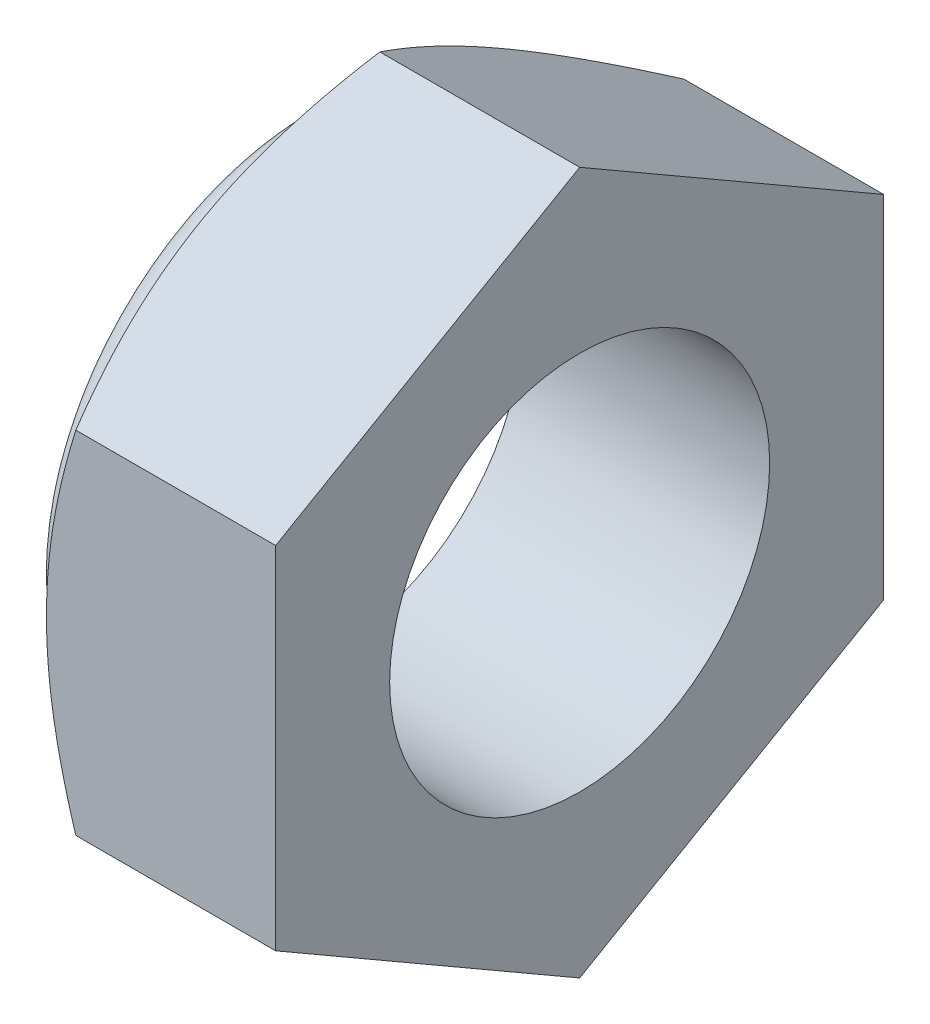
ISO-10303-21;
HEADER;
FILE_DESCRIPTION(('STEP AP214'),'2;1');
FILE_NAME('part.step','',(''),(''),'','','');
FILE_SCHEMA(('AUTOMOTIVE_DESIGN { 1 0 10303 214 1 1 1 1 }'));
ENDSEC;
DATA;
#1=APPLICATION_CONTEXT('core data for automotive mechanical design processes');
#2=APPLICATION_PROTOCOL_DEFINITION('international standard','automotive_design',2000,#1);
#3=PRODUCT_CONTEXT('',#1,'mechanical');
#4=PRODUCT('Part','Part','',(#3));
#5=PRODUCT_RELATED_PRODUCT_CATEGORY('part','',(#4));
#6=PRODUCT_DEFINITION_FORMATION('','',#4);
#7=PRODUCT_DEFINITION_CONTEXT('part definition',#1,'design');
#8=PRODUCT_DEFINITION('design','',#6,#7);
#9=PRODUCT_DEFINITION_SHAPE('','',#8);
#10=(LENGTH_UNIT() NAMED_UNIT(*) SI_UNIT(.MILLI.,.METRE.));
#11=(NAMED_UNIT(*) PLANE_ANGLE_UNIT() SI_UNIT($,.RADIAN.));
#12=(NAMED_UNIT(*) SI_UNIT($,.STERADIAN.) SOLID_ANGLE_UNIT());
#13=UNCERTAINTY_MEASURE_WITH_UNIT(LENGTH_MEASURE(1.E-05),#10,'distance_accuracy_value','');
#14=(GEOMETRIC_REPRESENTATION_CONTEXT(3) GLOBAL_UNCERTAINTY_ASSIGNED_CONTEXT((#13)) GLOBAL_UNIT_ASSIGNED_CONTEXT((#10,
#11,#12)) REPRESENTATION_CONTEXT('',''));
#15=CARTESIAN_POINT('',(0.,0.,0.));
#16=DIRECTION('',(0.,0.,1.));
#17=DIRECTION('',(1.,0.,0.));
#18=AXIS2_PLACEMENT_3D('',#15,#16,#17);
#19=CARTESIAN_POINT('',(0.,9.23760430703401,16.));
#20=DIRECTION('',(1.,0.,0.));
#21=DIRECTION('',(0.,0.,-1.));
#22=AXIS2_PLACEMENT_3D('',#19,#20,#21);
#23=PLANE('',#22);
#24=CARTESIAN_POINT('',(0.,0.,0.));
#25=DIRECTION('',(1.,0.,0.));
#26=DIRECTION('',(0.,0.,-1.));
#27=AXIS2_PLACEMENT_3D('',#24,#25,#26);
#28=CIRCLE('',#27,10.);
#29=CARTESIAN_POINT('',(0.,0.,10.));
#30=VERTEX_POINT('',#29);
#31=EDGE_CURVE('E211',#30,#30,#28,.T.);
#32=ORIENTED_EDGE('',*,*,#31,.T.);
#33=EDGE_LOOP('',(#32));
#34=FACE_BOUND('',#33,.T.);
#35=CARTESIAN_POINT('',(0.,0.,0.));
#36=DIRECTION('',(-1.,0.,0.));
#37=DIRECTION('',(0.,0.,1.));
#38=AXIS2_PLACEMENT_3D('',#35,#36,#37);
#39=CIRCLE('',#38,11.75);
#40=CARTESIAN_POINT('',(0.,0.,11.75));
#41=VERTEX_POINT('',#40);
#42=EDGE_CURVE('E11',#41,#41,#39,.F.);
#43=ORIENTED_EDGE('',*,*,#42,.F.);
#44=EDGE_LOOP('',(#43));
#45=FACE_BOUND('',#44,.T.);
#46=ADVANCED_FACE('F36',(#34,#45),#23,.F.);
#47=CARTESIAN_POINT('',(13.,18.475208614068,0.));
#48=DIRECTION('',(0.,-0.866025403784439,-0.5));
#49=DIRECTION('',(0.,0.5,-0.866025403784439));
#50=AXIS2_PLACEMENT_3D('',#47,#48,#49);
#51=PLANE('',#50);
#52=CARTESIAN_POINT('',(2.48402782965537,9.23748883698017,16.0002));
#53=CARTESIAN_POINT('',(2.35622189514865,9.44204117994002,15.6459049491863));
#54=CARTESIAN_POINT('',(2.23417552529317,9.64752331072618,15.2899994586171));
#55=CARTESIAN_POINT('',(2.00328958075527,10.0604195708602,14.5748421578098));
#56=CARTESIAN_POINT('',(1.89445538793848,10.2678344507007,14.2155890476803));
#57=CARTESIAN_POINT('',(1.69150207832333,10.6850904743633,13.4928804149324));
#58=CARTESIAN_POINT('',(1.59742535654908,10.8949368135091,13.1294158937497));
#59=CARTESIAN_POINT('',(1.42618391855995,11.3163430988134,12.3995187969738));
#60=CARTESIAN_POINT('',(1.34901800028337,11.527902922064,12.0330864342635));
#61=CARTESIAN_POINT('',(1.21528062863202,11.9463731920176,11.3082746652467));
#62=CARTESIAN_POINT('',(1.15817756809927,12.1532408961974,10.9499692911623));
#63=CARTESIAN_POINT('',(1.06290011847831,12.5680769915954,10.2314520971194));
#64=CARTESIAN_POINT('',(1.02472616226442,12.776045407875,9.87124023375338));
#65=CARTESIAN_POINT('',(0.96834746611396,13.1923576425367,9.15016629150687));
#66=CARTESIAN_POINT('',(0.95011366037074,13.4007004699159,8.78930592909349));
#67=CARTESIAN_POINT('',(0.93402035627322,13.8175788171063,8.06725145118442));
#68=CARTESIAN_POINT('',(0.936160048662314,14.0261143289348,7.70605734951504));
#69=CARTESIAN_POINT('',(0.958937588993571,14.412255701082,7.03724087405184));
#70=CARTESIAN_POINT('',(0.976811260230783,14.5899040223273,6.72954495577557));
#71=CARTESIAN_POINT('',(1.02697198795611,14.9446912735804,6.11503541072753));
#72=CARTESIAN_POINT('',(1.05925914160921,15.1218302001461,5.80822178991758));
#73=CARTESIAN_POINT('',(1.13767882018117,15.4755261882536,5.19560236808195));
#74=CARTESIAN_POINT('',(1.18382601047696,15.6520824322084,4.88979798315878));
#75=CARTESIAN_POINT('',(1.28913493966902,16.0042145183511,4.27988731898442));
#76=CARTESIAN_POINT('',(1.34829663434647,16.179790363868,3.97578103396726));
#77=CARTESIAN_POINT('',(1.54722369115664,16.7137423414229,3.05094908004027));
#78=CARTESIAN_POINT('',(1.70635721297245,17.0703163791325,2.43334473006729));
#79=CARTESIAN_POINT('',(2.06622138845492,17.7773355868302,1.20875154040773));
#80=CARTESIAN_POINT('',(2.26685434978692,18.1277930914713,0.601741336475672));
#81=CARTESIAN_POINT('',(2.48402782965537,18.4753240841219,-0.000199999999998277));
#82=B_SPLINE_CURVE_WITH_KNOTS('',3,(#52,#53,#54,#55,#56,#57,#58,#59,#60,#61,#62,#63,#64,#65,#66,
#67,#68,#69,#70,#71,#72,#73,#74,#75,#76,#77,#78,#79,#80,#81),.UNSPECIFIED.,.F.,.F.,(4,2,2,2,2,2,
2,2,2,2,2,2,2,2,4),(0.,1.28585383832253,2.57222971292877,3.86223593816667,5.15215043681124,
6.40471628367197,7.65731077312322,8.90807697151976,10.1587934883851,11.2257389499925,
12.2926916042611,13.3607772079389,14.428859182683,16.6194032169616,18.8048480903253),.UNSPECIFIED.);
#83=CARTESIAN_POINT('',(2.48395567616295,9.23760430703401,16.));
#84=VERTEX_POINT('',#83);
#85=CARTESIAN_POINT('',(2.48395567616295,18.475208614068,0.));
#86=VERTEX_POINT('',#85);
#87=EDGE_CURVE('E52',#84,#86,#82,.T.);
#88=ORIENTED_EDGE('',*,*,#87,.F.);
#89=DIRECTION('',(-1.,0.,0.));
#90=VECTOR('',#89,1.);
#91=CARTESIAN_POINT('',(13.,9.23760430703401,16.));
#92=LINE('',#91,#90);
#93=CARTESIAN_POINT('',(13.,9.23760430703401,16.));
#94=VERTEX_POINT('',#93);
#95=EDGE_CURVE('E95',#94,#84,#92,.T.);
#96=ORIENTED_EDGE('',*,*,#95,.F.);
#97=DIRECTION('',(0.,-0.5,0.866025403784439));
#98=VECTOR('',#97,1.);
#99=CARTESIAN_POINT('',(13.,18.475208614068,0.));
#100=LINE('',#99,#98);
#101=CARTESIAN_POINT('',(13.,18.475208614068,0.));
#102=VERTEX_POINT('',#101);
#103=EDGE_CURVE('E206',#102,#94,#100,.T.);
#104=ORIENTED_EDGE('',*,*,#103,.F.);
#105=DIRECTION('',(-1.,0.,0.));
#106=VECTOR('',#105,1.);
#107=CARTESIAN_POINT('',(13.,18.475208614068,0.));
#108=LINE('',#107,#106);
#109=EDGE_CURVE('E108',#102,#86,#108,.T.);
#110=ORIENTED_EDGE('',*,*,#109,.T.);
#111=EDGE_LOOP('',(#88,#96,#104,#110));
#112=FACE_BOUND('',#111,.T.);
#113=ADVANCED_FACE('F38',(#112),#51,.F.);
#114=CARTESIAN_POINT('',(13.,9.23760430703401,16.));
#115=DIRECTION('',(0.,0.,-1.));
#116=DIRECTION('',(-1.,0.,0.));
#117=AXIS2_PLACEMENT_3D('',#114,#115,#116);
#118=PLANE('',#117);
#119=CARTESIAN_POINT('',(8.90480884351565,-23.8874698405771,16.));
#120=CARTESIAN_POINT('',(8.73111807847969,-23.5529035977373,16.));
#121=CARTESIAN_POINT('',(8.55831159888479,-23.2178785094247,16.));
#122=CARTESIAN_POINT('',(8.21466498912881,-22.5468166451278,16.));
#123=CARTESIAN_POINT('',(8.04382488207962,-22.2107798573107,16.));
#124=CARTESIAN_POINT('',(7.53449932339774,-21.2009086145887,16.));
#125=CARTESIAN_POINT('',(7.19926766658299,-20.5254266671798,16.));
#126=CARTESIAN_POINT('',(6.53748870411256,-19.1650638835834,16.));
#127=CARTESIAN_POINT('',(6.2110075493406,-18.4801507873137,16.));
#128=CARTESIAN_POINT('',(5.57162944400834,-17.1040336673482,16.));
#129=CARTESIAN_POINT('',(5.25873177584443,-16.4128299783182,16.));
#130=CARTESIAN_POINT('',(4.63977485054366,-14.9993640799181,16.));
#131=CARTESIAN_POINT('',(4.33430517875104,-14.2768423005994,16.));
#132=CARTESIAN_POINT('',(3.74686522382272,-12.8221279092357,16.));
#133=CARTESIAN_POINT('',(3.46489784400095,-12.0899341152801,16.));
#134=CARTESIAN_POINT('',(2.93200406970659,-10.6161520590153,16.));
#135=CARTESIAN_POINT('',(2.68100770247132,-9.87458930737348,16.));
#136=CARTESIAN_POINT('',(2.21809749012398,-8.37939453731843,16.));
#137=CARTESIAN_POINT('',(2.00617006051235,-7.62576681340267,16.));
#138=CARTESIAN_POINT('',(1.72259788114702,-6.47495720037005,16.));
#139=CARTESIAN_POINT('',(1.63277665566015,-6.0822284929594,16.));
#140=CARTESIAN_POINT('',(1.46773447890387,-5.2936985175366,16.));
#141=CARTESIAN_POINT('',(1.39251316176112,-4.89789732677937,16.));
#142=CARTESIAN_POINT('',(1.25811686640524,-4.10360329151073,16.));
#143=CARTESIAN_POINT('',(1.1989403797924,-3.70511070363431,16.));
#144=CARTESIAN_POINT('',(1.09790554126732,-2.90592044910313,16.));
#145=CARTESIAN_POINT('',(1.05604714401592,-2.50522278822409,16.));
#146=CARTESIAN_POINT('',(0.991113527542771,-1.70808399783427,16.));
#147=CARTESIAN_POINT('',(0.967777516838604,-1.31166424724103,16.));
#148=CARTESIAN_POINT('',(0.939471927912536,-0.518170941065775,16.));
#149=CARTESIAN_POINT('',(0.934502055283372,-0.121097396066097,16.));
#150=CARTESIAN_POINT('',(0.943055477654574,0.672878326331558,16.));
#151=CARTESIAN_POINT('',(0.956580059104823,1.06978048988742,16.));
#152=CARTESIAN_POINT('',(1.00178139793263,1.86255096679384,16.));
#153=CARTESIAN_POINT('',(1.0334588966755,2.25841923725684,16.));
#154=CARTESIAN_POINT('',(1.12631626658434,3.16668606371892,16.));
#155=CARTESIAN_POINT('',(1.19349053851954,3.67847687623873,16.));
#156=CARTESIAN_POINT('',(1.35476926930414,4.69779258400616,16.));
#157=CARTESIAN_POINT('',(1.44887673660199,5.20531699617247,16.));
#158=CARTESIAN_POINT('',(1.66107348424446,6.21562836759083,16.));
#159=CARTESIAN_POINT('',(1.77917830760468,6.71841203429148,16.));
#160=CARTESIAN_POINT('',(2.0361882039576,7.71858348374597,16.));
#161=CARTESIAN_POINT('',(2.17509301494932,8.215971334382,16.));
#162=CARTESIAN_POINT('',(2.47409845911886,9.21673920823729,16.));
#163=CARTESIAN_POINT('',(2.63461212177091,9.71999506380116,16.));
#164=CARTESIAN_POINT('',(2.97139133833493,10.7211812260306,16.));
#165=CARTESIAN_POINT('',(3.14765699510677,11.2191114978966,16.));
#166=CARTESIAN_POINT('',(3.51339392660486,12.2099042127266,16.));
#167=CARTESIAN_POINT('',(3.70286114789863,12.702768158394,16.));
#168=CARTESIAN_POINT('',(4.09295035287518,13.6840363511946,16.));
#169=CARTESIAN_POINT('',(4.29357219347068,14.1724406554408,16.));
#170=CARTESIAN_POINT('',(4.79341837196844,15.3566186117951,16.));
#171=CARTESIAN_POINT('',(5.09761158238887,16.0502926736324,16.));
#172=CARTESIAN_POINT('',(5.72121783101163,17.4307869341618,16.));
#173=CARTESIAN_POINT('',(6.04063200741869,18.1176066156328,16.));
#174=CARTESIAN_POINT('',(6.69165198813326,19.4856571218058,16.));
#175=CARTESIAN_POINT('',(7.02326109097198,20.1668863725281,16.));
#176=CARTESIAN_POINT('',(7.69620543250852,21.5244893139814,16.));
#177=CARTESIAN_POINT('',(8.03754042078527,22.2008631291692,16.));
#178=CARTESIAN_POINT('',(8.72858600682176,23.5504545709518,16.));
#179=CARTESIAN_POINT('',(9.07830720891962,24.2236667578039,16.));
#180=CARTESIAN_POINT('',(9.7842672937288,25.5666644018743,16.));
#181=CARTESIAN_POINT('',(10.1405062104184,26.2364498412048,16.));
#182=CARTESIAN_POINT('',(10.8583328215057,27.5730137838194,16.));
#183=CARTESIAN_POINT('',(11.2199196933931,28.2397927293331,16.));
#184=CARTESIAN_POINT('',(11.9476194301153,29.5708716243697,16.));
#185=CARTESIAN_POINT('',(12.3137322847267,30.2351715794878,16.));
#186=CARTESIAN_POINT('',(13.3515815778486,32.1055974053188,16.));
#187=CARTESIAN_POINT('',(14.0277202507287,33.3092805534282,16.));
#188=CARTESIAN_POINT('',(15.3894537366813,35.7113398581849,16.));
#189=CARTESIAN_POINT('',(16.0750489487848,36.9097157880512,16.));
#190=CARTESIAN_POINT('',(17.451421981919,39.2986883824702,16.));
#191=CARTESIAN_POINT('',(18.1421780249996,40.489297603171,16.));
#192=CARTESIAN_POINT('',(19.1825323827763,42.2726940621074,16.));
#193=CARTESIAN_POINT('',(19.5300092451093,42.8667208160212,16.));
#194=CARTESIAN_POINT('',(20.2262311006083,44.0540292798519,16.));
#195=CARTESIAN_POINT('',(20.5749760913922,44.6473109911656,16.));
#196=CARTESIAN_POINT('',(20.9242828358097,45.2402618749302,16.));
#197=B_SPLINE_CURVE_WITH_KNOTS('',3,(#119,#120,#121,#122,#123,#124,#125,#126,#127,#128,#129,
#130,#131,#132,#133,#134,#135,#136,#137,#138,#139,#140,#141,#142,#143,#144,#145,#146,#147,#148,
#149,#150,#151,#152,#153,#154,#155,#156,#157,#158,#159,#160,#161,#162,#163,#164,#165,#166,#167,
#168,#169,#170,#171,#172,#173,#174,#175,#176,#177,#178,#179,#180,#181,#182,#183,#184,#185,#186,
#187,#188,#189,#190,#191,#192,#193,#194,#195,#196),.UNSPECIFIED.,.F.,.F.,(4,2,2,2,2,2,2,2,2,2,2,
2,2,2,2,2,2,2,2,2,2,2,2,2,2,2,2,2,2,2,2,2,2,2,2,2,2,2,4),(0.,1.13089431456393,2.26180190762565,
4.52400056817067,6.80012284566329,9.07612473093047,11.4291351559062,13.7824358263693,
16.1303183586455,18.4773829721998,19.6857621290957,20.8941110001306,22.1023462329723,
23.3105783026067,24.5014810062565,25.6923646197781,26.8833310738103,28.0743461703911,
29.6220612136447,31.1699492047925,32.718842972648,34.2677172319554,35.8521117042882,
37.4365165234077,39.020436989663,40.6043371426648,42.8764098116049,45.1486526507255,
47.4215146818988,49.694318244447,51.9701655124478,54.246024648313,56.52153732579,
58.7970448642237,62.9387373202539,67.0806050782887,71.2100206170363,73.2745948522922,
75.3391652111168),.UNSPECIFIED.);
#198=CARTESIAN_POINT('',(2.48395567616295,-9.23760430703401,16.));
#199=VERTEX_POINT('',#198);
#200=EDGE_CURVE('E163',#199,#84,#197,.T.);
#201=ORIENTED_EDGE('',*,*,#200,.F.);
#202=DIRECTION('',(-1.,0.,0.));
#203=VECTOR('',#202,1.);
#204=CARTESIAN_POINT('',(13.,-9.23760430703401,16.));
#205=LINE('',#204,#203);
#206=CARTESIAN_POINT('',(13.,-9.23760430703401,16.));
#207=VERTEX_POINT('',#206);
#208=EDGE_CURVE('E117',#207,#199,#205,.T.);
#209=ORIENTED_EDGE('',*,*,#208,.F.);
#210=DIRECTION('',(0.,-1.,0.));
#211=VECTOR('',#210,1.);
#212=CARTESIAN_POINT('',(13.,9.23760430703401,16.));
#213=LINE('',#212,#211);
#214=EDGE_CURVE('E212',#94,#207,#213,.T.);
#215=ORIENTED_EDGE('',*,*,#214,.F.);
#216=ORIENTED_EDGE('',*,*,#95,.T.);
#217=EDGE_LOOP('',(#201,#209,#215,#216));
#218=FACE_BOUND('',#217,.T.);
#219=ADVANCED_FACE('F173',(#218),#118,.F.);
#220=CARTESIAN_POINT('',(13.,-9.23760430703401,16.));
#221=DIRECTION('',(0.,0.866025403784439,-0.5));
#222=DIRECTION('',(0.,0.5,0.866025403784439));
#223=AXIS2_PLACEMENT_3D('',#220,#221,#222);
#224=PLANE('',#223);
#225=CARTESIAN_POINT('',(2.48402782965537,-18.4753240841219,-0.0002));
#226=CARTESIAN_POINT('',(2.35622189514865,-18.270771741162,0.3540950508137));
#227=CARTESIAN_POINT('',(2.23417552529317,-18.0652896103758,0.710000541382855));
#228=CARTESIAN_POINT('',(2.00328958075526,-17.6523933502418,1.42515784219021));
#229=CARTESIAN_POINT('',(1.89445538793848,-17.4449784704013,1.78441095231972));
#230=CARTESIAN_POINT('',(1.69150207832333,-17.0277224467387,2.50711958506755));
#231=CARTESIAN_POINT('',(1.59742535654908,-16.817876107593,2.87058410625027));
#232=CARTESIAN_POINT('',(1.42618391855994,-16.3964698222887,3.60048120302616));
#233=CARTESIAN_POINT('',(1.34901800028337,-16.184909999038,3.96691356573654));
#234=CARTESIAN_POINT('',(1.21528062863202,-15.7664397290844,4.6917253347533));
#235=CARTESIAN_POINT('',(1.15817756809927,-15.5595720249047,5.05003070883773));
#236=CARTESIAN_POINT('',(1.06290011847831,-15.1447359295067,5.7685479028806));
#237=CARTESIAN_POINT('',(1.02472616226442,-14.936767513227,6.12875976624661));
#238=CARTESIAN_POINT('',(0.968347466113959,-14.5204552785653,6.84983370849313));
#239=CARTESIAN_POINT('',(0.950113660370739,-14.3121124511861,7.21069407090651));
#240=CARTESIAN_POINT('',(0.934020356273218,-13.8952341039957,7.93274854881558));
#241=CARTESIAN_POINT('',(0.936160048662314,-13.6866985921672,8.29394265048496));
#242=CARTESIAN_POINT('',(0.958937588993571,-13.3005572200201,8.96275912594816));
#243=CARTESIAN_POINT('',(0.976811260230782,-13.1229088987747,9.27045504422442));
#244=CARTESIAN_POINT('',(1.02697198795611,-12.7681216475216,9.88496458927246));
#245=CARTESIAN_POINT('',(1.05925914160921,-12.590982720956,10.1917782100824));
#246=CARTESIAN_POINT('',(1.13767882018117,-12.2372867328484,10.804397631918));
#247=CARTESIAN_POINT('',(1.18382601047695,-12.0607304888936,11.1102020168412));
#248=CARTESIAN_POINT('',(1.28913493966902,-11.7085984027509,11.7201126810156));
#249=CARTESIAN_POINT('',(1.34829663434647,-11.533022557234,12.0242189660327));
#250=CARTESIAN_POINT('',(1.54722369115664,-10.9990705796791,12.9490509199597));
#251=CARTESIAN_POINT('',(1.70635721297245,-10.6424965419695,13.5666552699327));
#252=CARTESIAN_POINT('',(2.06622138845492,-9.93547733427179,14.7912484595923));
#253=CARTESIAN_POINT('',(2.26685434978692,-9.58501982963076,15.3982586635243));
#254=CARTESIAN_POINT('',(2.48402782965537,-9.23748883698017,16.0002));
#255=B_SPLINE_CURVE_WITH_KNOTS('',3,(#225,#226,#227,#228,#229,#230,#231,#232,#233,#234,#235,
#236,#237,#238,#239,#240,#241,#242,#243,#244,#245,#246,#247,#248,#249,#250,#251,#252,#253,#254),
.UNSPECIFIED.,.F.,.F.,(4,2,2,2,2,2,2,2,2,2,2,2,2,2,4),(0.,1.28585383832253,2.57222971292877,
3.86223593816667,5.15215043681124,6.40471628367198,7.65731077312322,8.90807697151976,
10.1587934883851,11.2257389499925,12.2926916042611,13.3607772079389,14.428859182683,
16.6194032169616,18.8048480903253),.UNSPECIFIED.);
#256=CARTESIAN_POINT('',(2.48395567616295,-18.475208614068,0.));
#257=VERTEX_POINT('',#256);
#258=EDGE_CURVE('E156',#257,#199,#255,.T.);
#259=ORIENTED_EDGE('',*,*,#258,.F.);
#260=DIRECTION('',(-1.,0.,0.));
#261=VECTOR('',#260,1.);
#262=CARTESIAN_POINT('',(13.,-18.475208614068,0.));
#263=LINE('',#262,#261);
#264=CARTESIAN_POINT('',(13.,-18.475208614068,0.));
#265=VERTEX_POINT('',#264);
#266=EDGE_CURVE('E110',#265,#257,#263,.T.);
#267=ORIENTED_EDGE('',*,*,#266,.F.);
#268=DIRECTION('',(0.,-0.5,-0.866025403784439));
#269=VECTOR('',#268,1.);
#270=CARTESIAN_POINT('',(13.,-9.23760430703401,16.));
#271=LINE('',#270,#269);
#272=EDGE_CURVE('E217',#207,#265,#271,.T.);
#273=ORIENTED_EDGE('',*,*,#272,.F.);
#274=ORIENTED_EDGE('',*,*,#208,.T.);
#275=EDGE_LOOP('',(#259,#267,#273,#274));
#276=FACE_BOUND('',#275,.T.);
#277=ADVANCED_FACE('F176',(#276),#224,.F.);
#278=CARTESIAN_POINT('',(13.,-18.475208614068,0.));
#279=DIRECTION('',(0.,0.866025403784439,0.5));
#280=DIRECTION('',(0.,-0.5,0.866025403784439));
#281=AXIS2_PLACEMENT_3D('',#278,#279,#280);
#282=PLANE('',#281);
#283=CARTESIAN_POINT('',(2.48402782965537,-9.23748883698017,-16.0002));
#284=CARTESIAN_POINT('',(2.35622189514866,-9.44204117994001,-15.6459049491863));
#285=CARTESIAN_POINT('',(2.23417552529317,-9.64752331072618,-15.2899994586171));
#286=CARTESIAN_POINT('',(2.00328958075527,-10.0604195708602,-14.5748421578098));
#287=CARTESIAN_POINT('',(1.89445538793848,-10.2678344507007,-14.2155890476803));
#288=CARTESIAN_POINT('',(1.69150207832333,-10.6850904743633,-13.4928804149324));
#289=CARTESIAN_POINT('',(1.59742535654909,-10.8949368135091,-13.1294158937497));
#290=CARTESIAN_POINT('',(1.42618391855995,-11.3163430988134,-12.3995187969738));
#291=CARTESIAN_POINT('',(1.34901800028337,-11.527902922064,-12.0330864342635));
#292=CARTESIAN_POINT('',(1.21528062863202,-11.9463731920176,-11.3082746652467));
#293=CARTESIAN_POINT('',(1.15817756809927,-12.1532408961974,-10.9499692911623));
#294=CARTESIAN_POINT('',(1.06290011847831,-12.5680769915954,-10.2314520971194));
#295=CARTESIAN_POINT('',(1.02472616226442,-12.776045407875,-9.87124023375339));
#296=CARTESIAN_POINT('',(0.96834746611396,-13.1923576425367,-9.15016629150687));
#297=CARTESIAN_POINT('',(0.950113660370741,-13.4007004699159,-8.78930592909349));
#298=CARTESIAN_POINT('',(0.93402035627322,-13.8175788171063,-8.06725145118442));
#299=CARTESIAN_POINT('',(0.936160048662315,-14.0261143289348,-7.70605734951504));
#300=CARTESIAN_POINT('',(0.958937588993571,-14.412255701082,-7.03724087405184));
#301=CARTESIAN_POINT('',(0.976811260230782,-14.5899040223273,-6.72954495577557));
#302=CARTESIAN_POINT('',(1.02697198795611,-14.9446912735804,-6.11503541072753));
#303=CARTESIAN_POINT('',(1.05925914160921,-15.1218302001461,-5.80822178991758));
#304=CARTESIAN_POINT('',(1.13767882018117,-15.4755261882536,-5.19560236808195));
#305=CARTESIAN_POINT('',(1.18382601047695,-15.6520824322084,-4.88979798315879));
#306=CARTESIAN_POINT('',(1.28913493966902,-16.0042145183511,-4.27988731898442));
#307=CARTESIAN_POINT('',(1.34829663434647,-16.179790363868,-3.97578103396726));
#308=CARTESIAN_POINT('',(1.54722369115664,-16.7137423414229,-3.05094908004027));
#309=CARTESIAN_POINT('',(1.70635721297245,-17.0703163791325,-2.43334473006729));
#310=CARTESIAN_POINT('',(2.06622138845492,-17.7773355868302,-1.20875154040773));
#311=CARTESIAN_POINT('',(2.26685434978692,-18.1277930914713,-0.601741336475671));
#312=CARTESIAN_POINT('',(2.48402782965537,-18.4753240841219,0.000199999999998668));
#313=B_SPLINE_CURVE_WITH_KNOTS('',3,(#283,#284,#285,#286,#287,#288,#289,#290,#291,#292,#293,
#294,#295,#296,#297,#298,#299,#300,#301,#302,#303,#304,#305,#306,#307,#308,#309,#310,#311,#312),
.UNSPECIFIED.,.F.,.F.,(4,2,2,2,2,2,2,2,2,2,2,2,2,2,4),(0.,1.28585383832253,2.57222971292877,
3.86223593816667,5.15215043681124,6.40471628367198,7.65731077312322,8.90807697151976,
10.1587934883851,11.2257389499925,12.2926916042611,13.3607772079389,14.428859182683,
16.6194032169616,18.8048480903253),.UNSPECIFIED.);
#314=CARTESIAN_POINT('',(2.48395567616296,-9.23760430703401,-16.));
#315=VERTEX_POINT('',#314);
#316=EDGE_CURVE('E104',#315,#257,#313,.T.);
#317=ORIENTED_EDGE('',*,*,#316,.F.);
#318=DIRECTION('',(-1.,0.,0.));
#319=VECTOR('',#318,1.);
#320=CARTESIAN_POINT('',(13.,-9.23760430703401,-16.));
#321=LINE('',#320,#319);
#322=CARTESIAN_POINT('',(13.,-9.23760430703401,-16.));
#323=VERTEX_POINT('',#322);
#324=EDGE_CURVE('E103',#323,#315,#321,.T.);
#325=ORIENTED_EDGE('',*,*,#324,.F.);
#326=DIRECTION('',(0.,0.5,-0.866025403784439));
#327=VECTOR('',#326,1.);
#328=CARTESIAN_POINT('',(13.,-18.475208614068,0.));
#329=LINE('',#328,#327);
#330=EDGE_CURVE('E219',#265,#323,#329,.T.);
#331=ORIENTED_EDGE('',*,*,#330,.F.);
#332=ORIENTED_EDGE('',*,*,#266,.T.);
#333=EDGE_LOOP('',(#317,#325,#331,#332));
#334=FACE_BOUND('',#333,.T.);
#335=ADVANCED_FACE('F180',(#334),#282,.F.);
#336=CARTESIAN_POINT('',(13.,-9.23760430703401,-16.));
#337=DIRECTION('',(0.,0.,1.));
#338=DIRECTION('',(0.,-1.,0.));
#339=AXIS2_PLACEMENT_3D('',#336,#337,#338);
#340=PLANE('',#339);
#341=CARTESIAN_POINT('',(8.90480884351566,-23.8874698405771,-16.));
#342=CARTESIAN_POINT('',(8.73111807847969,-23.5529035977373,-16.));
#343=CARTESIAN_POINT('',(8.5583115988848,-23.2178785094247,-16.));
#344=CARTESIAN_POINT('',(8.21466498912882,-22.5468166451278,-16.));
#345=CARTESIAN_POINT('',(8.04382488207962,-22.2107798573107,-16.));
#346=CARTESIAN_POINT('',(7.53449932339775,-21.2009086145887,-16.));
#347=CARTESIAN_POINT('',(7.199267666583,-20.5254266671798,-16.));
#348=CARTESIAN_POINT('',(6.53748870411257,-19.1650638835834,-16.));
#349=CARTESIAN_POINT('',(6.21100754934061,-18.4801507873137,-16.));
#350=CARTESIAN_POINT('',(5.57162944400835,-17.1040336673482,-16.));
#351=CARTESIAN_POINT('',(5.25873177584444,-16.4128299783182,-16.));
#352=CARTESIAN_POINT('',(4.63977485054366,-14.9993640799181,-16.));
#353=CARTESIAN_POINT('',(4.33430517875104,-14.2768423005994,-16.));
#354=CARTESIAN_POINT('',(3.74686522382272,-12.8221279092357,-16.));
#355=CARTESIAN_POINT('',(3.46489784400095,-12.0899341152801,-16.));
#356=CARTESIAN_POINT('',(2.93200406970659,-10.6161520590153,-16.));
#357=CARTESIAN_POINT('',(2.68100770247133,-9.87458930737348,-16.));
#358=CARTESIAN_POINT('',(2.21809749012398,-8.37939453731842,-16.));
#359=CARTESIAN_POINT('',(2.00617006051236,-7.62576681340267,-16.));
#360=CARTESIAN_POINT('',(1.72259788114702,-6.47495720037005,-16.));
#361=CARTESIAN_POINT('',(1.63277665566016,-6.0822284929594,-16.));
#362=CARTESIAN_POINT('',(1.46773447890387,-5.2936985175366,-16.));
#363=CARTESIAN_POINT('',(1.39251316176113,-4.89789732677937,-16.));
#364=CARTESIAN_POINT('',(1.25811686640524,-4.10360329151073,-16.));
#365=CARTESIAN_POINT('',(1.19894037979241,-3.70511070363431,-16.));
#366=CARTESIAN_POINT('',(1.09790554126732,-2.90592044910313,-16.));
#367=CARTESIAN_POINT('',(1.05604714401593,-2.50522278822409,-16.));
#368=CARTESIAN_POINT('',(0.991113527542772,-1.70808399783427,-16.));
#369=CARTESIAN_POINT('',(0.967777516838605,-1.31166424724103,-16.));
#370=CARTESIAN_POINT('',(0.939471927912537,-0.518170941065776,-16.));
#371=CARTESIAN_POINT('',(0.934502055283373,-0.121097396066097,-16.));
#372=CARTESIAN_POINT('',(0.943055477654574,0.672878326331557,-16.));
#373=CARTESIAN_POINT('',(0.956580059104824,1.06978048988742,-16.));
#374=CARTESIAN_POINT('',(1.00178139793263,1.86255096679384,-16.));
#375=CARTESIAN_POINT('',(1.0334588966755,2.25841923725684,-16.));
#376=CARTESIAN_POINT('',(1.12631626658434,3.16668606371892,-16.));
#377=CARTESIAN_POINT('',(1.19349053851954,3.67847687623873,-16.));
#378=CARTESIAN_POINT('',(1.35476926930414,4.69779258400616,-16.));
#379=CARTESIAN_POINT('',(1.44887673660199,5.20531699617247,-16.));
#380=CARTESIAN_POINT('',(1.66107348424446,6.21562836759083,-16.));
#381=CARTESIAN_POINT('',(1.77917830760468,6.71841203429149,-16.));
#382=CARTESIAN_POINT('',(2.0361882039576,7.71858348374597,-16.));
#383=CARTESIAN_POINT('',(2.17509301494932,8.215971334382,-16.));
#384=CARTESIAN_POINT('',(2.47409845911886,9.21673920823729,-16.));
#385=CARTESIAN_POINT('',(2.63461212177091,9.71999506380115,-16.));
#386=CARTESIAN_POINT('',(2.97139133833492,10.7211812260306,-16.));
#387=CARTESIAN_POINT('',(3.14765699510676,11.2191114978966,-16.));
#388=CARTESIAN_POINT('',(3.51339392660485,12.2099042127266,-16.));
#389=CARTESIAN_POINT('',(3.70286114789862,12.702768158394,-16.));
#390=CARTESIAN_POINT('',(4.09295035287517,13.6840363511946,-16.));
#391=CARTESIAN_POINT('',(4.29357219347067,14.1724406554408,-16.));
#392=CARTESIAN_POINT('',(4.79341837196843,15.3566186117951,-16.));
#393=CARTESIAN_POINT('',(5.09761158238887,16.0502926736324,-16.));
#394=CARTESIAN_POINT('',(5.72121783101163,17.4307869341618,-16.));
#395=CARTESIAN_POINT('',(6.04063200741869,18.1176066156328,-16.));
#396=CARTESIAN_POINT('',(6.69165198813326,19.4856571218058,-16.));
#397=CARTESIAN_POINT('',(7.02326109097197,20.1668863725281,-16.));
#398=CARTESIAN_POINT('',(7.69620543250851,21.5244893139814,-16.));
#399=CARTESIAN_POINT('',(8.03754042078526,22.2008631291692,-16.));
#400=CARTESIAN_POINT('',(8.72858600682175,23.5504545709518,-16.));
#401=CARTESIAN_POINT('',(9.07830720891961,24.2236667578039,-16.));
#402=CARTESIAN_POINT('',(9.78426729372879,25.5666644018743,-16.));
#403=CARTESIAN_POINT('',(10.1405062104184,26.2364498412048,-16.));
#404=CARTESIAN_POINT('',(10.8583328215057,27.5730137838194,-16.));
#405=CARTESIAN_POINT('',(11.2199196933931,28.2397927293331,-16.));
#406=CARTESIAN_POINT('',(11.9476194301153,29.5708716243697,-16.));
#407=CARTESIAN_POINT('',(12.3137322847267,30.2351715794878,-16.));
#408=CARTESIAN_POINT('',(13.3515815778486,32.1055974053188,-16.));
#409=CARTESIAN_POINT('',(14.0277202507287,33.3092805534282,-16.));
#410=CARTESIAN_POINT('',(15.3894537366813,35.7113398581849,-16.));
#411=CARTESIAN_POINT('',(16.0750489487848,36.9097157880512,-16.));
#412=CARTESIAN_POINT('',(17.451421981919,39.2986883824702,-16.));
#413=CARTESIAN_POINT('',(18.1421780249996,40.489297603171,-16.));
#414=CARTESIAN_POINT('',(19.1825323827763,42.2726940621074,-16.));
#415=CARTESIAN_POINT('',(19.5300092451093,42.8667208160212,-16.));
#416=CARTESIAN_POINT('',(20.2262311006083,44.0540292798518,-16.));
#417=CARTESIAN_POINT('',(20.5749760913922,44.6473109911656,-16.));
#418=CARTESIAN_POINT('',(20.9242828358097,45.2402618749302,-16.));
#419=B_SPLINE_CURVE_WITH_KNOTS('',3,(#341,#342,#343,#344,#345,#346,#347,#348,#349,#350,#351,
#352,#353,#354,#355,#356,#357,#358,#359,#360,#361,#362,#363,#364,#365,#366,#367,#368,#369,#370,
#371,#372,#373,#374,#375,#376,#377,#378,#379,#380,#381,#382,#383,#384,#385,#386,#387,#388,#389,
#390,#391,#392,#393,#394,#395,#396,#397,#398,#399,#400,#401,#402,#403,#404,#405,#406,#407,#408,
#409,#410,#411,#412,#413,#414,#415,#416,#417,#418),.UNSPECIFIED.,.F.,.F.,(4,2,2,2,2,2,2,2,2,2,2,
2,2,2,2,2,2,2,2,2,2,2,2,2,2,2,2,2,2,2,2,2,2,2,2,2,2,2,4),(0.,1.13089431456393,2.26180190762566,
4.52400056817067,6.80012284566329,9.07612473093048,11.4291351559062,13.7824358263693,
16.1303183586455,18.4773829721998,19.6857621290957,20.8941110001306,22.1023462329723,
23.3105783026068,24.5014810062565,25.6923646197782,26.8833310738103,28.0743461703911,
29.6220612136448,31.1699492047925,32.718842972648,34.2677172319554,35.8521117042882,
37.4365165234077,39.020436989663,40.6043371426648,42.876409811605,45.1486526507256,
47.4215146818988,49.694318244447,51.9701655124478,54.246024648313,56.52153732579,
58.7970448642237,62.9387373202539,67.0806050782887,71.2100206170363,73.2745948522922,
75.3391652111169),.UNSPECIFIED.);
#420=CARTESIAN_POINT('',(2.48395567616295,9.23760430703401,-16.));
#421=VERTEX_POINT('',#420);
#422=EDGE_CURVE('E90',#421,#315,#419,.F.);
#423=ORIENTED_EDGE('',*,*,#422,.F.);
#424=DIRECTION('',(-1.,0.,0.));
#425=VECTOR('',#424,1.);
#426=CARTESIAN_POINT('',(13.,9.23760430703401,-16.));
#427=LINE('',#426,#425);
#428=CARTESIAN_POINT('',(13.,9.23760430703401,-16.));
#429=VERTEX_POINT('',#428);
#430=EDGE_CURVE('E101',#429,#421,#427,.T.);
#431=ORIENTED_EDGE('',*,*,#430,.F.);
#432=DIRECTION('',(0.,1.,0.));
#433=VECTOR('',#432,1.);
#434=CARTESIAN_POINT('',(13.,-9.23760430703401,-16.));
#435=LINE('',#434,#433);
#436=EDGE_CURVE('E221',#323,#429,#435,.T.);
#437=ORIENTED_EDGE('',*,*,#436,.F.);
#438=ORIENTED_EDGE('',*,*,#324,.T.);
#439=EDGE_LOOP('',(#423,#431,#437,#438));
#440=FACE_BOUND('',#439,.T.);
#441=ADVANCED_FACE('F99',(#440),#340,.F.);
#442=CARTESIAN_POINT('',(13.,9.23760430703401,-16.));
#443=DIRECTION('',(0.,-0.866025403784439,0.5));
#444=DIRECTION('',(0.,-0.5,-0.866025403784439));
#445=AXIS2_PLACEMENT_3D('',#442,#443,#444);
#446=PLANE('',#445);
#447=CARTESIAN_POINT('',(2.48402782965537,18.4753240841219,0.0002));
#448=CARTESIAN_POINT('',(2.35622189514865,18.270771741162,-0.3540950508137));
#449=CARTESIAN_POINT('',(2.23417552529317,18.0652896103758,-0.710000541382855));
#450=CARTESIAN_POINT('',(2.00328958075526,17.6523933502418,-1.42515784219021));
#451=CARTESIAN_POINT('',(1.89445538793848,17.4449784704013,-1.78441095231972));
#452=CARTESIAN_POINT('',(1.69150207832333,17.0277224467387,-2.50711958506755));
#453=CARTESIAN_POINT('',(1.59742535654908,16.817876107593,-2.87058410625027));
#454=CARTESIAN_POINT('',(1.42618391855994,16.3964698222887,-3.60048120302616));
#455=CARTESIAN_POINT('',(1.34901800028337,16.184909999038,-3.96691356573654));
#456=CARTESIAN_POINT('',(1.21528062863202,15.7664397290844,-4.6917253347533));
#457=CARTESIAN_POINT('',(1.15817756809927,15.5595720249047,-5.05003070883773));
#458=CARTESIAN_POINT('',(1.06290011847831,15.1447359295067,-5.7685479028806));
#459=CARTESIAN_POINT('',(1.02472616226442,14.936767513227,-6.12875976624661));
#460=CARTESIAN_POINT('',(0.968347466113959,14.5204552785653,-6.84983370849313));
#461=CARTESIAN_POINT('',(0.950113660370739,14.3121124511861,-7.21069407090651));
#462=CARTESIAN_POINT('',(0.934020356273218,13.8952341039957,-7.93274854881558));
#463=CARTESIAN_POINT('',(0.936160048662314,13.6866985921672,-8.29394265048496));
#464=CARTESIAN_POINT('',(0.958937588993571,13.3005572200201,-8.96275912594816));
#465=CARTESIAN_POINT('',(0.976811260230782,13.1229088987747,-9.27045504422442));
#466=CARTESIAN_POINT('',(1.02697198795611,12.7681216475216,-9.88496458927246));
#467=CARTESIAN_POINT('',(1.05925914160921,12.590982720956,-10.1917782100824));
#468=CARTESIAN_POINT('',(1.13767882018117,12.2372867328484,-10.804397631918));
#469=CARTESIAN_POINT('',(1.18382601047695,12.0607304888936,-11.1102020168412));
#470=CARTESIAN_POINT('',(1.28913493966902,11.7085984027509,-11.7201126810156));
#471=CARTESIAN_POINT('',(1.34829663434647,11.533022557234,-12.0242189660327));
#472=CARTESIAN_POINT('',(1.54722369115664,10.9990705796791,-12.9490509199597));
#473=CARTESIAN_POINT('',(1.70635721297245,10.6424965419695,-13.5666552699327));
#474=CARTESIAN_POINT('',(2.06622138845492,9.93547733427179,-14.7912484595923));
#475=CARTESIAN_POINT('',(2.26685434978692,9.58501982963076,-15.3982586635243));
#476=CARTESIAN_POINT('',(2.48402782965537,9.23748883698017,-16.0002));
#477=B_SPLINE_CURVE_WITH_KNOTS('',3,(#447,#448,#449,#450,#451,#452,#453,#454,#455,#456,#457,
#458,#459,#460,#461,#462,#463,#464,#465,#466,#467,#468,#469,#470,#471,#472,#473,#474,#475,#476),
.UNSPECIFIED.,.F.,.F.,(4,2,2,2,2,2,2,2,2,2,2,2,2,2,4),(0.,1.28585383832253,2.57222971292877,
3.86223593816667,5.15215043681124,6.40471628367198,7.65731077312322,8.90807697151976,
10.1587934883851,11.2257389499925,12.2926916042611,13.3607772079389,14.428859182683,
16.6194032169616,18.8048480903253),.UNSPECIFIED.);
#478=EDGE_CURVE('E45',#86,#421,#477,.T.);
#479=ORIENTED_EDGE('',*,*,#478,.F.);
#480=ORIENTED_EDGE('',*,*,#109,.F.);
#481=DIRECTION('',(0.,0.5,0.866025403784439));
#482=VECTOR('',#481,1.);
#483=CARTESIAN_POINT('',(13.,9.23760430703401,-16.));
#484=LINE('',#483,#482);
#485=EDGE_CURVE('E60',#429,#102,#484,.T.);
#486=ORIENTED_EDGE('',*,*,#485,.F.);
#487=ORIENTED_EDGE('',*,*,#430,.T.);
#488=EDGE_LOOP('',(#479,#480,#486,#487));
#489=FACE_BOUND('',#488,.T.);
#490=ADVANCED_FACE('F107',(#489),#446,.F.);
#491=CARTESIAN_POINT('',(13.,9.23760430703401,16.));
#492=DIRECTION('',(1.,0.,0.));
#493=DIRECTION('',(0.,0.,-1.));
#494=AXIS2_PLACEMENT_3D('',#491,#492,#493);
#495=PLANE('',#494);
#496=ORIENTED_EDGE('',*,*,#103,.T.);
#497=ORIENTED_EDGE('',*,*,#214,.T.);
#498=ORIENTED_EDGE('',*,*,#272,.T.);
#499=ORIENTED_EDGE('',*,*,#330,.T.);
#500=ORIENTED_EDGE('',*,*,#436,.T.);
#501=ORIENTED_EDGE('',*,*,#485,.T.);
#502=EDGE_LOOP('',(#496,#497,#498,#499,#500,#501));
#503=FACE_BOUND('',#502,.T.);
#504=CARTESIAN_POINT('',(13.,0.,0.));
#505=DIRECTION('',(1.,0.,0.));
#506=DIRECTION('',(0.,0.,-1.));
#507=AXIS2_PLACEMENT_3D('',#504,#505,#506);
#508=CIRCLE('',#507,10.);
#509=CARTESIAN_POINT('',(13.,0.,10.));
#510=VERTEX_POINT('',#509);
#511=EDGE_CURVE('E210',#510,#510,#508,.T.);
#512=ORIENTED_EDGE('',*,*,#511,.F.);
#513=EDGE_LOOP('',(#512));
#514=FACE_BOUND('',#513,.T.);
#515=ADVANCED_FACE('F190',(#503,#514),#495,.T.);
#516=CARTESIAN_POINT('',(13.,0.,0.));
#517=DIRECTION('',(-1.,0.,0.));
#518=DIRECTION('',(0.,0.,1.));
#519=AXIS2_PLACEMENT_3D('',#516,#517,#518);
#520=CYLINDRICAL_SURFACE('',#519,10.);
#521=CARTESIAN_POINT('',(13.,0.,10.));
#522=CARTESIAN_POINT('',(12.8645833333333,0.,10.));
#523=CARTESIAN_POINT('',(12.7291666666667,0.,10.));
#524=CARTESIAN_POINT('',(12.4583333333333,0.,10.));
#525=CARTESIAN_POINT('',(12.3229166666667,0.,10.));
#526=CARTESIAN_POINT('',(12.0520833333333,0.,10.));
#527=CARTESIAN_POINT('',(11.9166666666667,0.,10.));
#528=CARTESIAN_POINT('',(11.6458333333333,0.,10.));
#529=CARTESIAN_POINT('',(11.5104166666667,0.,10.));
#530=CARTESIAN_POINT('',(11.2395833333333,0.,10.));
#531=CARTESIAN_POINT('',(11.1041666666667,0.,10.));
#532=CARTESIAN_POINT('',(10.8333333333333,0.,10.));
#533=CARTESIAN_POINT('',(10.6979166666667,0.,10.));
#534=CARTESIAN_POINT('',(10.4270833333333,0.,10.));
#535=CARTESIAN_POINT('',(10.2916666666667,0.,10.));
#536=CARTESIAN_POINT('',(10.0208333333333,0.,10.));
#537=CARTESIAN_POINT('',(9.88541666666667,0.,10.));
#538=CARTESIAN_POINT('',(9.61458333333333,0.,10.));
#539=CARTESIAN_POINT('',(9.47916666666667,0.,10.));
#540=CARTESIAN_POINT('',(9.20833333333333,0.,10.));
#541=CARTESIAN_POINT('',(9.07291666666666,0.,10.));
#542=CARTESIAN_POINT('',(8.80208333333333,0.,10.));
#543=CARTESIAN_POINT('',(8.66666666666667,0.,10.));
#544=CARTESIAN_POINT('',(8.39583333333333,0.,10.));
#545=CARTESIAN_POINT('',(8.26041666666667,0.,10.));
#546=CARTESIAN_POINT('',(7.98958333333333,0.,10.));
#547=CARTESIAN_POINT('',(7.85416666666667,0.,10.));
#548=CARTESIAN_POINT('',(7.58333333333333,0.,10.));
#549=CARTESIAN_POINT('',(7.44791666666667,0.,10.));
#550=CARTESIAN_POINT('',(7.17708333333333,0.,10.));
#551=CARTESIAN_POINT('',(7.04166666666667,0.,10.));
#552=CARTESIAN_POINT('',(6.77083333333333,0.,10.));
#553=CARTESIAN_POINT('',(6.63541666666667,0.,10.));
#554=CARTESIAN_POINT('',(6.36458333333333,0.,10.));
#555=CARTESIAN_POINT('',(6.22916666666667,0.,10.));
#556=CARTESIAN_POINT('',(5.95833333333333,0.,10.));
#557=CARTESIAN_POINT('',(5.82291666666667,0.,10.));
#558=CARTESIAN_POINT('',(5.55208333333333,0.,10.));
#559=CARTESIAN_POINT('',(5.41666666666667,0.,10.));
#560=CARTESIAN_POINT('',(5.14583333333333,0.,10.));
#561=CARTESIAN_POINT('',(5.01041666666667,0.,10.));
#562=CARTESIAN_POINT('',(4.73958333333333,0.,10.));
#563=CARTESIAN_POINT('',(4.60416666666667,0.,10.));
#564=CARTESIAN_POINT('',(4.33333333333333,0.,10.));
#565=CARTESIAN_POINT('',(4.19791666666667,0.,10.));
#566=CARTESIAN_POINT('',(3.92708333333333,0.,10.));
#567=CARTESIAN_POINT('',(3.79166666666667,0.,10.));
#568=CARTESIAN_POINT('',(3.52083333333333,0.,10.));
#569=CARTESIAN_POINT('',(3.38541666666667,0.,10.));
#570=CARTESIAN_POINT('',(3.11458333333333,0.,10.));
#571=CARTESIAN_POINT('',(2.97916666666667,0.,10.));
#572=CARTESIAN_POINT('',(2.70833333333333,0.,10.));
#573=CARTESIAN_POINT('',(2.57291666666667,0.,10.));
#574=CARTESIAN_POINT('',(2.30208333333333,0.,10.));
#575=CARTESIAN_POINT('',(2.16666666666667,0.,10.));
#576=CARTESIAN_POINT('',(1.89583333333333,0.,10.));
#577=CARTESIAN_POINT('',(1.76041666666667,0.,10.));
#578=CARTESIAN_POINT('',(1.48958333333333,0.,10.));
#579=CARTESIAN_POINT('',(1.35416666666667,0.,10.));
#580=CARTESIAN_POINT('',(1.08333333333333,0.,10.));
#581=CARTESIAN_POINT('',(0.947916666666667,0.,10.));
#582=CARTESIAN_POINT('',(0.677083333333334,0.,10.));
#583=CARTESIAN_POINT('',(0.541666666666667,0.,10.));
#584=CARTESIAN_POINT('',(0.270833333333334,0.,10.));
#585=CARTESIAN_POINT('',(0.135416666666667,0.,10.));
#586=CARTESIAN_POINT('',(0.,0.,10.));
#587=B_SPLINE_CURVE_WITH_KNOTS('',3,(#521,#522,#523,#524,#525,#526,#527,#528,#529,#530,#531,
#532,#533,#534,#535,#536,#537,#538,#539,#540,#541,#542,#543,#544,#545,#546,#547,#548,#549,#550,
#551,#552,#553,#554,#555,#556,#557,#558,#559,#560,#561,#562,#563,#564,#565,#566,#567,#568,#569,
#570,#571,#572,#573,#574,#575,#576,#577,#578,#579,#580,#581,#582,#583,#584,#585,#586),
.UNSPECIFIED.,.F.,.F.,(4,2,2,2,2,2,2,2,2,2,2,2,2,2,2,2,2,2,2,2,2,2,2,2,2,2,2,2,2,2,2,2,4),(0.,
0.40625,0.812500000000001,1.21875,1.625,2.03125,2.4375,2.84375,3.25,3.65625,4.0625,4.46875,
4.875,5.28125,5.6875,6.09375,6.5,6.90625,7.3125,7.71875,8.125,8.53125,8.9375,9.34375,9.75,
10.15625,10.5625,10.96875,11.375,11.78125,12.1875,12.59375,13.),.UNSPECIFIED.);
#588=EDGE_CURVE('BSEAM135',#510,#30,#587,.T.);
#589=ORIENTED_EDGE('',*,*,#511,.T.);
#590=ORIENTED_EDGE('',*,*,#31,.F.);
#591=ORIENTED_EDGE('',*,*,#588,.T.);
#592=ORIENTED_EDGE('',*,*,#588,.F.);
#593=EDGE_LOOP('',(#589,#591,#590,#592));
#594=FACE_BOUND('',#593,.T.);
#595=ADVANCED_FACE('F135',(#594),#520,.F.);
#596=CARTESIAN_POINT('',(0.,0.,0.));
#597=DIRECTION('',(1.,0.,0.));
#598=DIRECTION('',(0.,0.,-1.));
#599=AXIS2_PLACEMENT_3D('',#596,#597,#598);
#600=CONICAL_SURFACE('',#599,14.5,1.01229645778996);
#601=CARTESIAN_POINT('',(0.,0.,0.));
#602=DIRECTION('',(-1.,0.,0.));
#603=DIRECTION('',(0.,0.,1.));
#604=AXIS2_PLACEMENT_3D('',#601,#602,#603);
#605=CIRCLE('',#604,14.5);
#606=CARTESIAN_POINT('',(0.,0.,14.5));
#607=VERTEX_POINT('',#606);
#608=EDGE_CURVE('E105',#607,#607,#605,.T.);
#609=ORIENTED_EDGE('',*,*,#608,.F.);
#610=EDGE_LOOP('',(#609));
#611=FACE_BOUND('',#610,.T.);
#612=ORIENTED_EDGE('',*,*,#87,.T.);
#613=ORIENTED_EDGE('',*,*,#478,.T.);
#614=ORIENTED_EDGE('',*,*,#422,.T.);
#615=ORIENTED_EDGE('',*,*,#316,.T.);
#616=ORIENTED_EDGE('',*,*,#258,.T.);
#617=ORIENTED_EDGE('',*,*,#200,.T.);
#618=EDGE_LOOP('',(#612,#613,#614,#615,#616,#617));
#619=FACE_BOUND('',#618,.T.);
#620=ADVANCED_FACE('F89',(#611,#619),#600,.T.);
#621=CARTESIAN_POINT('',(0.,0.,0.));
#622=DIRECTION('',(-1.,0.,0.));
#623=DIRECTION('',(0.,0.,1.));
#624=AXIS2_PLACEMENT_3D('',#621,#622,#623);
#625=TOROIDAL_SURFACE('',#624,13.125,1.375);
#626=ORIENTED_EDGE('',*,*,#42,.T.);
#627=EDGE_LOOP('',(#626));
#628=FACE_BOUND('',#627,.T.);
#629=ORIENTED_EDGE('',*,*,#608,.T.);
#630=EDGE_LOOP('',(#629));
#631=FACE_BOUND('',#630,.T.);
#632=ADVANCED_FACE('F134',(#628,#631),#625,.T.);
#633=CLOSED_SHELL('',(#46,#113,#219,#277,#335,#441,#490,#515,#595,#620,#632));
#634=MANIFOLD_SOLID_BREP('B2',#633);
#635=ADVANCED_BREP_SHAPE_REPRESENTATION('',(#18,#634),#14);
#636=SHAPE_DEFINITION_REPRESENTATION(#9,#635);
ENDSEC;
END-ISO-10303-21;
